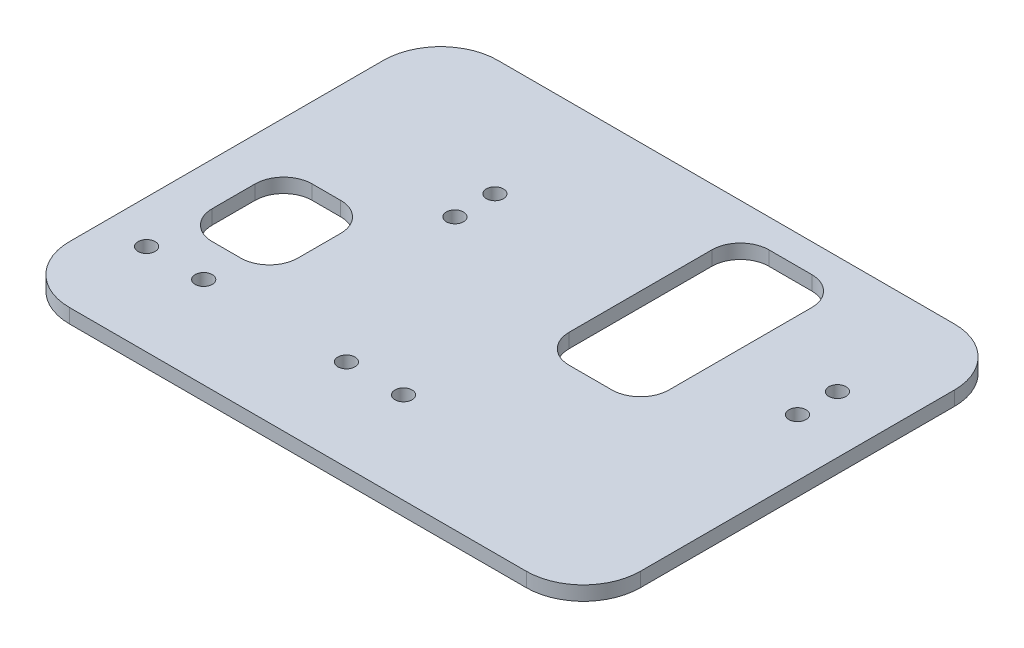
ISO-10303-21;
HEADER;
FILE_DESCRIPTION(('STEP AP214'),'2;1');
FILE_NAME('part.step','',(''),(''),'','','');
FILE_SCHEMA(('AUTOMOTIVE_DESIGN { 1 0 10303 214 1 1 1 1 }'));
ENDSEC;
DATA;
#1=APPLICATION_CONTEXT('core data for automotive mechanical design processes');
#2=APPLICATION_PROTOCOL_DEFINITION('international standard','automotive_design',2000,#1);
#3=PRODUCT_CONTEXT('',#1,'mechanical');
#4=PRODUCT('Part','Part','',(#3));
#5=PRODUCT_RELATED_PRODUCT_CATEGORY('part','',(#4));
#6=PRODUCT_DEFINITION_FORMATION('','',#4);
#7=PRODUCT_DEFINITION_CONTEXT('part definition',#1,'design');
#8=PRODUCT_DEFINITION('design','',#6,#7);
#9=PRODUCT_DEFINITION_SHAPE('','',#8);
#10=(LENGTH_UNIT() NAMED_UNIT(*) SI_UNIT(.MILLI.,.METRE.));
#11=(NAMED_UNIT(*) PLANE_ANGLE_UNIT() SI_UNIT($,.RADIAN.));
#12=(NAMED_UNIT(*) SI_UNIT($,.STERADIAN.) SOLID_ANGLE_UNIT());
#13=UNCERTAINTY_MEASURE_WITH_UNIT(LENGTH_MEASURE(1.E-05),#10,'distance_accuracy_value','');
#14=(GEOMETRIC_REPRESENTATION_CONTEXT(3) GLOBAL_UNCERTAINTY_ASSIGNED_CONTEXT((#13)) GLOBAL_UNIT_ASSIGNED_CONTEXT((#10,
#11,#12)) REPRESENTATION_CONTEXT('',''));
#15=CARTESIAN_POINT('',(0.,0.,0.));
#16=DIRECTION('',(0.,0.,1.));
#17=DIRECTION('',(1.,0.,0.));
#18=AXIS2_PLACEMENT_3D('',#15,#16,#17);
#19=CARTESIAN_POINT('',(-85.,5.,-75.));
#20=DIRECTION('',(1.,0.,0.));
#21=DIRECTION('',(0.,0.,-1.));
#22=AXIS2_PLACEMENT_3D('',#19,#20,#21);
#23=PLANE('',#22);
#24=DIRECTION('',(0.,0.,1.));
#25=VECTOR('',#24,1.);
#26=CARTESIAN_POINT('',(-85.,5.,-75.));
#27=LINE('',#26,#25);
#28=CARTESIAN_POINT('',(-85.,5.,-55.));
#29=VERTEX_POINT('',#28);
#30=CARTESIAN_POINT('',(-85.,5.,55.));
#31=VERTEX_POINT('',#30);
#32=EDGE_CURVE('E315',#29,#31,#27,.T.);
#33=ORIENTED_EDGE('',*,*,#32,.F.);
#34=DIRECTION('',(0.,-1.,0.));
#35=VECTOR('',#34,1.);
#36=CARTESIAN_POINT('',(-85.,0.,-55.));
#37=LINE('',#36,#35);
#38=CARTESIAN_POINT('',(-85.,0.,-55.));
#39=VERTEX_POINT('',#38);
#40=EDGE_CURVE('E11',#29,#39,#37,.T.);
#41=ORIENTED_EDGE('',*,*,#40,.T.);
#42=DIRECTION('',(0.,0.,1.));
#43=VECTOR('',#42,1.);
#44=CARTESIAN_POINT('',(-85.,0.,-75.));
#45=LINE('',#44,#43);
#46=CARTESIAN_POINT('',(-85.,0.,55.));
#47=VERTEX_POINT('',#46);
#48=EDGE_CURVE('E328',#39,#47,#45,.T.);
#49=ORIENTED_EDGE('',*,*,#48,.T.);
#50=DIRECTION('',(0.,-1.,0.));
#51=VECTOR('',#50,1.);
#52=CARTESIAN_POINT('',(-85.,5.,55.));
#53=LINE('',#52,#51);
#54=EDGE_CURVE('E43',#47,#31,#53,.F.);
#55=ORIENTED_EDGE('',*,*,#54,.T.);
#56=EDGE_LOOP('',(#33,#41,#49,#55));
#57=FACE_BOUND('',#56,.T.);
#58=ADVANCED_FACE('F35',(#57),#23,.F.);
#59=CARTESIAN_POINT('',(-85.,5.,75.));
#60=DIRECTION('',(0.,0.,-1.));
#61=DIRECTION('',(-1.,0.,0.));
#62=AXIS2_PLACEMENT_3D('',#59,#60,#61);
#63=PLANE('',#62);
#64=DIRECTION('',(1.,0.,0.));
#65=VECTOR('',#64,1.);
#66=CARTESIAN_POINT('',(-85.,0.,75.));
#67=LINE('',#66,#65);
#68=CARTESIAN_POINT('',(-65.,0.,75.));
#69=VERTEX_POINT('',#68);
#70=CARTESIAN_POINT('',(95.,0.,75.));
#71=VERTEX_POINT('',#70);
#72=EDGE_CURVE('E331',#69,#71,#67,.T.);
#73=ORIENTED_EDGE('',*,*,#72,.T.);
#74=DIRECTION('',(0.,-1.,0.));
#75=VECTOR('',#74,1.);
#76=CARTESIAN_POINT('',(95.,5.,75.));
#77=LINE('',#76,#75);
#78=CARTESIAN_POINT('',(95.,5.,75.));
#79=VERTEX_POINT('',#78);
#80=EDGE_CURVE('E420',#71,#79,#77,.F.);
#81=ORIENTED_EDGE('',*,*,#80,.T.);
#82=DIRECTION('',(1.,0.,0.));
#83=VECTOR('',#82,1.);
#84=CARTESIAN_POINT('',(-85.,5.,75.));
#85=LINE('',#84,#83);
#86=CARTESIAN_POINT('',(-65.,5.,75.));
#87=VERTEX_POINT('',#86);
#88=EDGE_CURVE('E318',#87,#79,#85,.T.);
#89=ORIENTED_EDGE('',*,*,#88,.F.);
#90=DIRECTION('',(0.,-1.,0.));
#91=VECTOR('',#90,1.);
#92=CARTESIAN_POINT('',(-65.,5.,75.));
#93=LINE('',#92,#91);
#94=EDGE_CURVE('E417',#87,#69,#93,.T.);
#95=ORIENTED_EDGE('',*,*,#94,.T.);
#96=EDGE_LOOP('',(#73,#81,#89,#95));
#97=FACE_BOUND('',#96,.T.);
#98=ADVANCED_FACE('F444',(#97),#63,.F.);
#99=CARTESIAN_POINT('',(115.,5.,-75.));
#100=DIRECTION('',(1.,0.,0.));
#101=DIRECTION('',(0.,0.,-1.));
#102=AXIS2_PLACEMENT_3D('',#99,#100,#101);
#103=PLANE('',#102);
#104=DIRECTION('',(0.,0.,1.));
#105=VECTOR('',#104,1.);
#106=CARTESIAN_POINT('',(115.,5.,-75.));
#107=LINE('',#106,#105);
#108=CARTESIAN_POINT('',(115.,5.,-55.));
#109=VERTEX_POINT('',#108);
#110=CARTESIAN_POINT('',(115.,5.,55.));
#111=VERTEX_POINT('',#110);
#112=EDGE_CURVE('E322',#109,#111,#107,.T.);
#113=ORIENTED_EDGE('',*,*,#112,.T.);
#114=DIRECTION('',(0.,-1.,0.));
#115=VECTOR('',#114,1.);
#116=CARTESIAN_POINT('',(115.,0.,55.));
#117=LINE('',#116,#115);
#118=CARTESIAN_POINT('',(115.,0.,55.));
#119=VERTEX_POINT('',#118);
#120=EDGE_CURVE('E406',#111,#119,#117,.T.);
#121=ORIENTED_EDGE('',*,*,#120,.T.);
#122=DIRECTION('',(0.,0.,1.));
#123=VECTOR('',#122,1.);
#124=CARTESIAN_POINT('',(115.,0.,-75.));
#125=LINE('',#124,#123);
#126=CARTESIAN_POINT('',(115.,0.,-55.));
#127=VERTEX_POINT('',#126);
#128=EDGE_CURVE('E334',#127,#119,#125,.T.);
#129=ORIENTED_EDGE('',*,*,#128,.F.);
#130=DIRECTION('',(0.,-1.,0.));
#131=VECTOR('',#130,1.);
#132=CARTESIAN_POINT('',(115.,5.,-55.));
#133=LINE('',#132,#131);
#134=EDGE_CURVE('E400',#127,#109,#133,.F.);
#135=ORIENTED_EDGE('',*,*,#134,.T.);
#136=EDGE_LOOP('',(#113,#121,#129,#135));
#137=FACE_BOUND('',#136,.T.);
#138=ADVANCED_FACE('F454',(#137),#103,.T.);
#139=CARTESIAN_POINT('',(-85.,5.,-75.));
#140=DIRECTION('',(0.,0.,-1.));
#141=DIRECTION('',(-1.,0.,0.));
#142=AXIS2_PLACEMENT_3D('',#139,#140,#141);
#143=PLANE('',#142);
#144=DIRECTION('',(1.,0.,0.));
#145=VECTOR('',#144,1.);
#146=CARTESIAN_POINT('',(-85.,5.,-75.));
#147=LINE('',#146,#145);
#148=CARTESIAN_POINT('',(-65.,5.,-75.));
#149=VERTEX_POINT('',#148);
#150=CARTESIAN_POINT('',(95.,5.,-75.));
#151=VERTEX_POINT('',#150);
#152=EDGE_CURVE('E325',#149,#151,#147,.T.);
#153=ORIENTED_EDGE('',*,*,#152,.T.);
#154=DIRECTION('',(0.,-1.,0.));
#155=VECTOR('',#154,1.);
#156=CARTESIAN_POINT('',(95.,5.,-75.));
#157=LINE('',#156,#155);
#158=CARTESIAN_POINT('',(95.,0.,-75.));
#159=VERTEX_POINT('',#158);
#160=EDGE_CURVE('E430',#151,#159,#157,.T.);
#161=ORIENTED_EDGE('',*,*,#160,.T.);
#162=DIRECTION('',(1.,0.,0.));
#163=VECTOR('',#162,1.);
#164=CARTESIAN_POINT('',(-85.,0.,-75.));
#165=LINE('',#164,#163);
#166=CARTESIAN_POINT('',(-65.,0.,-75.));
#167=VERTEX_POINT('',#166);
#168=EDGE_CURVE('E319',#167,#159,#165,.T.);
#169=ORIENTED_EDGE('',*,*,#168,.F.);
#170=DIRECTION('',(0.,-1.,0.));
#171=VECTOR('',#170,1.);
#172=CARTESIAN_POINT('',(-65.,5.,-75.));
#173=LINE('',#172,#171);
#174=EDGE_CURVE('E57',#167,#149,#173,.F.);
#175=ORIENTED_EDGE('',*,*,#174,.T.);
#176=EDGE_LOOP('',(#153,#161,#169,#175));
#177=FACE_BOUND('',#176,.T.);
#178=ADVANCED_FACE('F459',(#177),#143,.T.);
#179=CARTESIAN_POINT('',(0.,5.,0.));
#180=DIRECTION('',(0.,1.,0.));
#181=DIRECTION('',(0.,0.,1.));
#182=AXIS2_PLACEMENT_3D('',#179,#180,#181);
#183=PLANE('',#182);
#184=CARTESIAN_POINT('',(95.,5.,-20.));
#185=DIRECTION('',(0.,1.,0.));
#186=DIRECTION('',(0.,0.,1.));
#187=AXIS2_PLACEMENT_3D('',#184,#185,#186);
#188=CIRCLE('',#187,3.00000000000001);
#189=CARTESIAN_POINT('',(95.,5.,-17.));
#190=VERTEX_POINT('',#189);
#191=EDGE_CURVE('E255',#190,#190,#188,.T.);
#192=ORIENTED_EDGE('',*,*,#191,.F.);
#193=EDGE_LOOP('',(#192));
#194=FACE_BOUND('',#193,.T.);
#195=CARTESIAN_POINT('',(95.,5.,-34.));
#196=DIRECTION('',(0.,1.,0.));
#197=DIRECTION('',(0.,0.,1.));
#198=AXIS2_PLACEMENT_3D('',#195,#196,#197);
#199=CIRCLE('',#198,3.00000000000001);
#200=CARTESIAN_POINT('',(95.,5.,-31.));
#201=VERTEX_POINT('',#200);
#202=EDGE_CURVE('E244',#201,#201,#199,.T.);
#203=ORIENTED_EDGE('',*,*,#202,.F.);
#204=EDGE_LOOP('',(#203));
#205=FACE_BOUND('',#204,.T.);
#206=CARTESIAN_POINT('',(40.,5.,-55.));
#207=DIRECTION('',(0.,1.,0.));
#208=DIRECTION('',(0.,0.,-1.));
#209=AXIS2_PLACEMENT_3D('',#206,#207,#208);
#210=CIRCLE('',#209,10.);
#211=CARTESIAN_POINT('',(40.,5.,-65.));
#212=VERTEX_POINT('',#211);
#213=CARTESIAN_POINT('',(30.,5.,-55.));
#214=VERTEX_POINT('',#213);
#215=EDGE_CURVE('E219',#212,#214,#210,.T.);
#216=ORIENTED_EDGE('',*,*,#215,.F.);
#217=DIRECTION('',(-1.,0.,0.));
#218=VECTOR('',#217,1.);
#219=CARTESIAN_POINT('',(40.,5.,-65.));
#220=LINE('',#219,#218);
#221=CARTESIAN_POINT('',(55.,5.,-65.));
#222=VERTEX_POINT('',#221);
#223=EDGE_CURVE('E239',#222,#212,#220,.T.);
#224=ORIENTED_EDGE('',*,*,#223,.F.);
#225=CARTESIAN_POINT('',(55.,5.,-55.));
#226=DIRECTION('',(0.,1.,0.));
#227=DIRECTION('',(0.,0.,-1.));
#228=AXIS2_PLACEMENT_3D('',#225,#226,#227);
#229=CIRCLE('',#228,10.);
#230=CARTESIAN_POINT('',(65.,5.,-55.));
#231=VERTEX_POINT('',#230);
#232=EDGE_CURVE('E236',#231,#222,#229,.T.);
#233=ORIENTED_EDGE('',*,*,#232,.F.);
#234=DIRECTION('',(0.,0.,-1.));
#235=VECTOR('',#234,1.);
#236=CARTESIAN_POINT('',(65.,5.,-5.00000000000001));
#237=LINE('',#236,#235);
#238=CARTESIAN_POINT('',(65.,5.,-5.00000000000001));
#239=VERTEX_POINT('',#238);
#240=EDGE_CURVE('E233',#239,#231,#237,.T.);
#241=ORIENTED_EDGE('',*,*,#240,.F.);
#242=CARTESIAN_POINT('',(55.,5.,-5.00000000000001));
#243=DIRECTION('',(0.,1.,0.));
#244=DIRECTION('',(0.,0.,1.));
#245=AXIS2_PLACEMENT_3D('',#242,#243,#244);
#246=CIRCLE('',#245,10.);
#247=CARTESIAN_POINT('',(55.,5.,4.99999999999999));
#248=VERTEX_POINT('',#247);
#249=EDGE_CURVE('E227',#248,#239,#246,.T.);
#250=ORIENTED_EDGE('',*,*,#249,.F.);
#251=DIRECTION('',(1.,0.,0.));
#252=VECTOR('',#251,1.);
#253=CARTESIAN_POINT('',(40.,5.,4.99999999999999));
#254=LINE('',#253,#252);
#255=CARTESIAN_POINT('',(40.,5.,4.99999999999999));
#256=VERTEX_POINT('',#255);
#257=EDGE_CURVE('E225',#256,#248,#254,.T.);
#258=ORIENTED_EDGE('',*,*,#257,.F.);
#259=CARTESIAN_POINT('',(40.,5.,-5.00000000000001));
#260=DIRECTION('',(0.,1.,0.));
#261=DIRECTION('',(0.,0.,-1.));
#262=AXIS2_PLACEMENT_3D('',#259,#260,#261);
#263=CIRCLE('',#262,10.);
#264=CARTESIAN_POINT('',(30.,5.,-5.00000000000001));
#265=VERTEX_POINT('',#264);
#266=EDGE_CURVE('E203',#265,#256,#263,.T.);
#267=ORIENTED_EDGE('',*,*,#266,.F.);
#268=DIRECTION('',(0.,0.,1.));
#269=VECTOR('',#268,1.);
#270=CARTESIAN_POINT('',(30.,5.,-5.00000000000001));
#271=LINE('',#270,#269);
#272=EDGE_CURVE('E214',#214,#265,#271,.T.);
#273=ORIENTED_EDGE('',*,*,#272,.F.);
#274=EDGE_LOOP('',(#216,#224,#233,#241,#250,#258,#267,#273));
#275=FACE_BOUND('',#274,.T.);
#276=CARTESIAN_POINT('',(-25.,5.,-34.));
#277=DIRECTION('',(0.,1.,0.));
#278=DIRECTION('',(0.,0.,1.));
#279=AXIS2_PLACEMENT_3D('',#276,#277,#278);
#280=CIRCLE('',#279,2.99999999999999);
#281=CARTESIAN_POINT('',(-25.,5.,-31.));
#282=VERTEX_POINT('',#281);
#283=EDGE_CURVE('E258',#282,#282,#280,.T.);
#284=ORIENTED_EDGE('',*,*,#283,.F.);
#285=EDGE_LOOP('',(#284));
#286=FACE_BOUND('',#285,.T.);
#287=CARTESIAN_POINT('',(-25.,5.,-20.));
#288=DIRECTION('',(0.,1.,0.));
#289=DIRECTION('',(0.,0.,1.));
#290=AXIS2_PLACEMENT_3D('',#287,#288,#289);
#291=CIRCLE('',#290,2.99999999999999);
#292=CARTESIAN_POINT('',(-25.,5.,-17.));
#293=VERTEX_POINT('',#292);
#294=EDGE_CURVE('E267',#293,#293,#291,.T.);
#295=ORIENTED_EDGE('',*,*,#294,.F.);
#296=EDGE_LOOP('',(#295));
#297=FACE_BOUND('',#296,.T.);
#298=CARTESIAN_POINT('',(-50.,5.,43.));
#299=DIRECTION('',(0.,1.,0.));
#300=DIRECTION('',(0.,0.,1.));
#301=AXIS2_PLACEMENT_3D('',#298,#299,#300);
#302=CIRCLE('',#301,3.);
#303=CARTESIAN_POINT('',(-50.,5.,46.));
#304=VERTEX_POINT('',#303);
#305=EDGE_CURVE('E304',#304,#304,#302,.T.);
#306=ORIENTED_EDGE('',*,*,#305,.F.);
#307=EDGE_LOOP('',(#306));
#308=FACE_BOUND('',#307,.T.);
#309=CARTESIAN_POINT('',(0.,5.,43.));
#310=DIRECTION('',(0.,1.,0.));
#311=DIRECTION('',(0.,0.,1.));
#312=AXIS2_PLACEMENT_3D('',#309,#310,#311);
#313=CIRCLE('',#312,3.);
#314=CARTESIAN_POINT('',(0.,5.,46.));
#315=VERTEX_POINT('',#314);
#316=EDGE_CURVE('E262',#315,#315,#313,.T.);
#317=ORIENTED_EDGE('',*,*,#316,.F.);
#318=EDGE_LOOP('',(#317));
#319=FACE_BOUND('',#318,.T.);
#320=CARTESIAN_POINT('',(20.,5.,43.));
#321=DIRECTION('',(0.,1.,0.));
#322=DIRECTION('',(0.,0.,1.));
#323=AXIS2_PLACEMENT_3D('',#320,#321,#322);
#324=CIRCLE('',#323,3.00000000000001);
#325=CARTESIAN_POINT('',(20.,5.,46.));
#326=VERTEX_POINT('',#325);
#327=EDGE_CURVE('E259',#326,#326,#324,.T.);
#328=ORIENTED_EDGE('',*,*,#327,.F.);
#329=EDGE_LOOP('',(#328));
#330=FACE_BOUND('',#329,.T.);
#331=CARTESIAN_POINT('',(-60.,5.,4.99999999999999));
#332=DIRECTION('',(0.,1.,0.));
#333=DIRECTION('',(0.,0.,-1.));
#334=AXIS2_PLACEMENT_3D('',#331,#332,#333);
#335=CIRCLE('',#334,10.);
#336=CARTESIAN_POINT('',(-60.,5.,-5.00000000000001));
#337=VERTEX_POINT('',#336);
#338=CARTESIAN_POINT('',(-70.,5.,5.00000000000007));
#339=VERTEX_POINT('',#338);
#340=EDGE_CURVE('E264',#337,#339,#335,.T.);
#341=ORIENTED_EDGE('',*,*,#340,.F.);
#342=DIRECTION('',(-1.,0.,0.));
#343=VECTOR('',#342,1.);
#344=CARTESIAN_POINT('',(-60.,5.,-5.00000000000001));
#345=LINE('',#344,#343);
#346=CARTESIAN_POINT('',(-50.0000000000001,5.,-5.00000000000001));
#347=VERTEX_POINT('',#346);
#348=EDGE_CURVE('E285',#347,#337,#345,.T.);
#349=ORIENTED_EDGE('',*,*,#348,.F.);
#350=CARTESIAN_POINT('',(-50.,5.,4.99999999999999));
#351=DIRECTION('',(0.,1.,0.));
#352=DIRECTION('',(0.,0.,-1.));
#353=AXIS2_PLACEMENT_3D('',#350,#351,#352);
#354=CIRCLE('',#353,10.);
#355=CARTESIAN_POINT('',(-40.,5.,5.00000000000006));
#356=VERTEX_POINT('',#355);
#357=EDGE_CURVE('E282',#356,#347,#354,.T.);
#358=ORIENTED_EDGE('',*,*,#357,.F.);
#359=DIRECTION('',(0.,0.,-1.));
#360=VECTOR('',#359,1.);
#361=CARTESIAN_POINT('',(-40.,5.,19.9999999999999));
#362=LINE('',#361,#360);
#363=CARTESIAN_POINT('',(-40.,5.,19.9999999999999));
#364=VERTEX_POINT('',#363);
#365=EDGE_CURVE('E279',#364,#356,#362,.T.);
#366=ORIENTED_EDGE('',*,*,#365,.F.);
#367=CARTESIAN_POINT('',(-50.,5.,20.));
#368=DIRECTION('',(0.,1.,0.));
#369=DIRECTION('',(0.,0.,1.));
#370=AXIS2_PLACEMENT_3D('',#367,#368,#369);
#371=CIRCLE('',#370,10.);
#372=CARTESIAN_POINT('',(-50.0000000000001,5.,30.));
#373=VERTEX_POINT('',#372);
#374=EDGE_CURVE('E276',#373,#364,#371,.T.);
#375=ORIENTED_EDGE('',*,*,#374,.F.);
#376=DIRECTION('',(1.,0.,0.));
#377=VECTOR('',#376,1.);
#378=CARTESIAN_POINT('',(-59.9999999999999,5.,30.));
#379=LINE('',#378,#377);
#380=CARTESIAN_POINT('',(-59.9999999999999,5.,30.));
#381=VERTEX_POINT('',#380);
#382=EDGE_CURVE('E273',#381,#373,#379,.T.);
#383=ORIENTED_EDGE('',*,*,#382,.F.);
#384=CARTESIAN_POINT('',(-60.,5.,20.));
#385=DIRECTION('',(0.,1.,0.));
#386=DIRECTION('',(0.,0.,-1.));
#387=AXIS2_PLACEMENT_3D('',#384,#385,#386);
#388=CIRCLE('',#387,10.);
#389=CARTESIAN_POINT('',(-70.,5.,19.9999999999999));
#390=VERTEX_POINT('',#389);
#391=EDGE_CURVE('E270',#390,#381,#388,.T.);
#392=ORIENTED_EDGE('',*,*,#391,.F.);
#393=DIRECTION('',(0.,0.,1.));
#394=VECTOR('',#393,1.);
#395=CARTESIAN_POINT('',(-70.,5.,19.9999999999999));
#396=LINE('',#395,#394);
#397=EDGE_CURVE('E266',#339,#390,#396,.T.);
#398=ORIENTED_EDGE('',*,*,#397,.F.);
#399=EDGE_LOOP('',(#341,#349,#358,#366,#375,#383,#392,#398));
#400=FACE_BOUND('',#399,.T.);
#401=CARTESIAN_POINT('',(-70.,5.,43.));
#402=DIRECTION('',(0.,1.,0.));
#403=DIRECTION('',(0.,0.,1.));
#404=AXIS2_PLACEMENT_3D('',#401,#402,#403);
#405=CIRCLE('',#404,3.00000000000001);
#406=CARTESIAN_POINT('',(-70.,5.,46.));
#407=VERTEX_POINT('',#406);
#408=EDGE_CURVE('E310',#407,#407,#405,.T.);
#409=ORIENTED_EDGE('',*,*,#408,.F.);
#410=EDGE_LOOP('',(#409));
#411=FACE_BOUND('',#410,.T.);
#412=ORIENTED_EDGE('',*,*,#88,.T.);
#413=CARTESIAN_POINT('',(95.,5.,55.));
#414=DIRECTION('',(0.,1.,0.));
#415=DIRECTION('',(0.,0.,1.));
#416=AXIS2_PLACEMENT_3D('',#413,#414,#415);
#417=CIRCLE('',#416,20.);
#418=EDGE_CURVE('E427',#79,#111,#417,.T.);
#419=ORIENTED_EDGE('',*,*,#418,.T.);
#420=ORIENTED_EDGE('',*,*,#112,.F.);
#421=CARTESIAN_POINT('',(95.,5.,-55.));
#422=DIRECTION('',(0.,1.,0.));
#423=DIRECTION('',(0.,0.,1.));
#424=AXIS2_PLACEMENT_3D('',#421,#422,#423);
#425=CIRCLE('',#424,20.);
#426=EDGE_CURVE('E50',#109,#151,#425,.T.);
#427=ORIENTED_EDGE('',*,*,#426,.T.);
#428=ORIENTED_EDGE('',*,*,#152,.F.);
#429=CARTESIAN_POINT('',(-65.,5.,-55.));
#430=DIRECTION('',(0.,1.,0.));
#431=DIRECTION('',(0.,0.,1.));
#432=AXIS2_PLACEMENT_3D('',#429,#430,#431);
#433=CIRCLE('',#432,20.);
#434=EDGE_CURVE('E424',#149,#29,#433,.T.);
#435=ORIENTED_EDGE('',*,*,#434,.T.);
#436=ORIENTED_EDGE('',*,*,#32,.T.);
#437=CARTESIAN_POINT('',(-65.,5.,55.));
#438=DIRECTION('',(0.,1.,0.));
#439=DIRECTION('',(0.,0.,1.));
#440=AXIS2_PLACEMENT_3D('',#437,#438,#439);
#441=CIRCLE('',#440,20.);
#442=EDGE_CURVE('E422',#31,#87,#441,.T.);
#443=ORIENTED_EDGE('',*,*,#442,.T.);
#444=EDGE_LOOP('',(#412,#419,#420,#427,#428,#435,#436,#443));
#445=FACE_BOUND('',#444,.T.);
#446=ADVANCED_FACE('F221',(#194,#205,#275,#286,#297,#308,#319,#330,#400,#411,#445),#183,.T.);
#447=CARTESIAN_POINT('',(0.,0.,0.));
#448=DIRECTION('',(0.,1.,0.));
#449=DIRECTION('',(0.,0.,1.));
#450=AXIS2_PLACEMENT_3D('',#447,#448,#449);
#451=PLANE('',#450);
#452=CARTESIAN_POINT('',(95.,0.,-20.));
#453=DIRECTION('',(0.,1.,0.));
#454=DIRECTION('',(0.,0.,1.));
#455=AXIS2_PLACEMENT_3D('',#452,#453,#454);
#456=CIRCLE('',#455,3.00000000000001);
#457=CARTESIAN_POINT('',(95.,0.,-17.));
#458=VERTEX_POINT('',#457);
#459=EDGE_CURVE('E314',#458,#458,#456,.T.);
#460=ORIENTED_EDGE('',*,*,#459,.T.);
#461=EDGE_LOOP('',(#460));
#462=FACE_BOUND('',#461,.T.);
#463=CARTESIAN_POINT('',(95.,0.,-34.));
#464=DIRECTION('',(0.,1.,0.));
#465=DIRECTION('',(0.,0.,1.));
#466=AXIS2_PLACEMENT_3D('',#463,#464,#465);
#467=CIRCLE('',#466,3.00000000000001);
#468=CARTESIAN_POINT('',(95.,0.,-31.));
#469=VERTEX_POINT('',#468);
#470=EDGE_CURVE('E379',#469,#469,#467,.T.);
#471=ORIENTED_EDGE('',*,*,#470,.T.);
#472=EDGE_LOOP('',(#471));
#473=FACE_BOUND('',#472,.T.);
#474=DIRECTION('',(-1.,0.,0.));
#475=VECTOR('',#474,1.);
#476=CARTESIAN_POINT('',(0.,0.,-65.));
#477=LINE('',#476,#475);
#478=CARTESIAN_POINT('',(55.,0.,-65.));
#479=VERTEX_POINT('',#478);
#480=CARTESIAN_POINT('',(40.,0.,-65.));
#481=VERTEX_POINT('',#480);
#482=EDGE_CURVE('E394',#479,#481,#477,.T.);
#483=ORIENTED_EDGE('',*,*,#482,.T.);
#484=CARTESIAN_POINT('',(40.,0.,-55.));
#485=DIRECTION('',(0.,1.,0.));
#486=DIRECTION('',(0.,0.,1.));
#487=AXIS2_PLACEMENT_3D('',#484,#485,#486);
#488=CIRCLE('',#487,10.);
#489=CARTESIAN_POINT('',(30.,0.,-55.));
#490=VERTEX_POINT('',#489);
#491=EDGE_CURVE('E397',#481,#490,#488,.T.);
#492=ORIENTED_EDGE('',*,*,#491,.T.);
#493=DIRECTION('',(0.,0.,1.));
#494=VECTOR('',#493,1.);
#495=CARTESIAN_POINT('',(30.,0.,0.));
#496=LINE('',#495,#494);
#497=CARTESIAN_POINT('',(30.,0.,-5.00000000000001));
#498=VERTEX_POINT('',#497);
#499=EDGE_CURVE('E364',#490,#498,#496,.T.);
#500=ORIENTED_EDGE('',*,*,#499,.T.);
#501=CARTESIAN_POINT('',(40.,0.,-5.00000000000001));
#502=DIRECTION('',(0.,1.,0.));
#503=DIRECTION('',(0.,0.,1.));
#504=AXIS2_PLACEMENT_3D('',#501,#502,#503);
#505=CIRCLE('',#504,10.);
#506=CARTESIAN_POINT('',(40.,0.,4.99999999999999));
#507=VERTEX_POINT('',#506);
#508=EDGE_CURVE('E206',#498,#507,#505,.T.);
#509=ORIENTED_EDGE('',*,*,#508,.T.);
#510=DIRECTION('',(1.,0.,0.));
#511=VECTOR('',#510,1.);
#512=CARTESIAN_POINT('',(0.,0.,4.99999999999999));
#513=LINE('',#512,#511);
#514=CARTESIAN_POINT('',(55.,0.,4.99999999999999));
#515=VERTEX_POINT('',#514);
#516=EDGE_CURVE('E382',#507,#515,#513,.T.);
#517=ORIENTED_EDGE('',*,*,#516,.T.);
#518=CARTESIAN_POINT('',(55.,0.,-5.00000000000001));
#519=DIRECTION('',(0.,1.,0.));
#520=DIRECTION('',(0.,0.,1.));
#521=AXIS2_PLACEMENT_3D('',#518,#519,#520);
#522=CIRCLE('',#521,10.);
#523=CARTESIAN_POINT('',(65.,0.,-5.00000000000001));
#524=VERTEX_POINT('',#523);
#525=EDGE_CURVE('E385',#515,#524,#522,.T.);
#526=ORIENTED_EDGE('',*,*,#525,.T.);
#527=DIRECTION('',(0.,0.,-1.));
#528=VECTOR('',#527,1.);
#529=CARTESIAN_POINT('',(65.,0.,0.));
#530=LINE('',#529,#528);
#531=CARTESIAN_POINT('',(65.,0.,-55.));
#532=VERTEX_POINT('',#531);
#533=EDGE_CURVE('E388',#524,#532,#530,.T.);
#534=ORIENTED_EDGE('',*,*,#533,.T.);
#535=CARTESIAN_POINT('',(55.,0.,-55.));
#536=DIRECTION('',(0.,1.,0.));
#537=DIRECTION('',(0.,0.,1.));
#538=AXIS2_PLACEMENT_3D('',#535,#536,#537);
#539=CIRCLE('',#538,10.);
#540=EDGE_CURVE('E391',#532,#479,#539,.T.);
#541=ORIENTED_EDGE('',*,*,#540,.T.);
#542=EDGE_LOOP('',(#483,#492,#500,#509,#517,#526,#534,#541));
#543=FACE_BOUND('',#542,.T.);
#544=CARTESIAN_POINT('',(-25.,0.,-34.));
#545=DIRECTION('',(0.,1.,0.));
#546=DIRECTION('',(0.,0.,1.));
#547=AXIS2_PLACEMENT_3D('',#544,#545,#546);
#548=CIRCLE('',#547,2.99999999999999);
#549=CARTESIAN_POINT('',(-25.,0.,-31.));
#550=VERTEX_POINT('',#549);
#551=EDGE_CURVE('E376',#550,#550,#548,.T.);
#552=ORIENTED_EDGE('',*,*,#551,.T.);
#553=EDGE_LOOP('',(#552));
#554=FACE_BOUND('',#553,.T.);
#555=CARTESIAN_POINT('',(-25.,0.,-20.));
#556=DIRECTION('',(0.,1.,0.));
#557=DIRECTION('',(0.,0.,1.));
#558=AXIS2_PLACEMENT_3D('',#555,#556,#557);
#559=CIRCLE('',#558,2.99999999999999);
#560=CARTESIAN_POINT('',(-25.,0.,-17.));
#561=VERTEX_POINT('',#560);
#562=EDGE_CURVE('E373',#561,#561,#559,.T.);
#563=ORIENTED_EDGE('',*,*,#562,.T.);
#564=EDGE_LOOP('',(#563));
#565=FACE_BOUND('',#564,.T.);
#566=CARTESIAN_POINT('',(-50.,0.,43.));
#567=DIRECTION('',(0.,1.,0.));
#568=DIRECTION('',(0.,0.,1.));
#569=AXIS2_PLACEMENT_3D('',#566,#567,#568);
#570=CIRCLE('',#569,3.);
#571=CARTESIAN_POINT('',(-50.,0.,46.));
#572=VERTEX_POINT('',#571);
#573=EDGE_CURVE('E370',#572,#572,#570,.T.);
#574=ORIENTED_EDGE('',*,*,#573,.T.);
#575=EDGE_LOOP('',(#574));
#576=FACE_BOUND('',#575,.T.);
#577=CARTESIAN_POINT('',(0.,0.,43.));
#578=DIRECTION('',(0.,1.,0.));
#579=DIRECTION('',(0.,0.,1.));
#580=AXIS2_PLACEMENT_3D('',#577,#578,#579);
#581=CIRCLE('',#580,3.);
#582=CARTESIAN_POINT('',(0.,0.,46.));
#583=VERTEX_POINT('',#582);
#584=EDGE_CURVE('E367',#583,#583,#581,.T.);
#585=ORIENTED_EDGE('',*,*,#584,.T.);
#586=EDGE_LOOP('',(#585));
#587=FACE_BOUND('',#586,.T.);
#588=CARTESIAN_POINT('',(20.,0.,43.));
#589=DIRECTION('',(0.,1.,0.));
#590=DIRECTION('',(0.,0.,1.));
#591=AXIS2_PLACEMENT_3D('',#588,#589,#590);
#592=CIRCLE('',#591,3.00000000000001);
#593=CARTESIAN_POINT('',(20.,0.,46.));
#594=VERTEX_POINT('',#593);
#595=EDGE_CURVE('E307',#594,#594,#592,.T.);
#596=ORIENTED_EDGE('',*,*,#595,.T.);
#597=EDGE_LOOP('',(#596));
#598=FACE_BOUND('',#597,.T.);
#599=DIRECTION('',(-1.,0.,0.));
#600=VECTOR('',#599,1.);
#601=CARTESIAN_POINT('',(0.,0.,-5.00000000000002));
#602=LINE('',#601,#600);
#603=CARTESIAN_POINT('',(-50.0000000000001,0.,-5.00000000000001));
#604=VERTEX_POINT('',#603);
#605=CARTESIAN_POINT('',(-60.,0.,-5.00000000000001));
#606=VERTEX_POINT('',#605);
#607=EDGE_CURVE('E358',#604,#606,#602,.T.);
#608=ORIENTED_EDGE('',*,*,#607,.T.);
#609=CARTESIAN_POINT('',(-60.,0.,4.99999999999999));
#610=DIRECTION('',(0.,1.,0.));
#611=DIRECTION('',(0.,0.,1.));
#612=AXIS2_PLACEMENT_3D('',#609,#610,#611);
#613=CIRCLE('',#612,10.);
#614=CARTESIAN_POINT('',(-70.,0.,5.00000000000007));
#615=VERTEX_POINT('',#614);
#616=EDGE_CURVE('E361',#606,#615,#613,.T.);
#617=ORIENTED_EDGE('',*,*,#616,.T.);
#618=DIRECTION('',(0.,0.,1.));
#619=VECTOR('',#618,1.);
#620=CARTESIAN_POINT('',(-70.,0.,0.));
#621=LINE('',#620,#619);
#622=CARTESIAN_POINT('',(-70.,0.,19.9999999999999));
#623=VERTEX_POINT('',#622);
#624=EDGE_CURVE('E327',#615,#623,#621,.T.);
#625=ORIENTED_EDGE('',*,*,#624,.T.);
#626=CARTESIAN_POINT('',(-60.,0.,20.));
#627=DIRECTION('',(0.,1.,0.));
#628=DIRECTION('',(0.,0.,1.));
#629=AXIS2_PLACEMENT_3D('',#626,#627,#628);
#630=CIRCLE('',#629,10.);
#631=CARTESIAN_POINT('',(-59.9999999999999,0.,30.));
#632=VERTEX_POINT('',#631);
#633=EDGE_CURVE('E343',#623,#632,#630,.T.);
#634=ORIENTED_EDGE('',*,*,#633,.T.);
#635=DIRECTION('',(1.,0.,0.));
#636=VECTOR('',#635,1.);
#637=CARTESIAN_POINT('',(0.,0.,30.));
#638=LINE('',#637,#636);
#639=CARTESIAN_POINT('',(-50.0000000000001,0.,30.));
#640=VERTEX_POINT('',#639);
#641=EDGE_CURVE('E346',#632,#640,#638,.T.);
#642=ORIENTED_EDGE('',*,*,#641,.T.);
#643=CARTESIAN_POINT('',(-50.,0.,20.));
#644=DIRECTION('',(0.,1.,0.));
#645=DIRECTION('',(0.,0.,1.));
#646=AXIS2_PLACEMENT_3D('',#643,#644,#645);
#647=CIRCLE('',#646,10.);
#648=CARTESIAN_POINT('',(-40.,0.,19.9999999999999));
#649=VERTEX_POINT('',#648);
#650=EDGE_CURVE('E349',#640,#649,#647,.T.);
#651=ORIENTED_EDGE('',*,*,#650,.T.);
#652=DIRECTION('',(0.,0.,-1.));
#653=VECTOR('',#652,1.);
#654=CARTESIAN_POINT('',(-40.,0.,0.));
#655=LINE('',#654,#653);
#656=CARTESIAN_POINT('',(-40.,0.,5.00000000000006));
#657=VERTEX_POINT('',#656);
#658=EDGE_CURVE('E352',#649,#657,#655,.T.);
#659=ORIENTED_EDGE('',*,*,#658,.T.);
#660=CARTESIAN_POINT('',(-50.,0.,4.99999999999999));
#661=DIRECTION('',(0.,1.,0.));
#662=DIRECTION('',(0.,0.,1.));
#663=AXIS2_PLACEMENT_3D('',#660,#661,#662);
#664=CIRCLE('',#663,10.);
#665=EDGE_CURVE('E355',#657,#604,#664,.T.);
#666=ORIENTED_EDGE('',*,*,#665,.T.);
#667=EDGE_LOOP('',(#608,#617,#625,#634,#642,#651,#659,#666));
#668=FACE_BOUND('',#667,.T.);
#669=CARTESIAN_POINT('',(-70.,0.,43.));
#670=DIRECTION('',(0.,1.,0.));
#671=DIRECTION('',(0.,0.,1.));
#672=AXIS2_PLACEMENT_3D('',#669,#670,#671);
#673=CIRCLE('',#672,3.00000000000001);
#674=CARTESIAN_POINT('',(-70.,0.,46.));
#675=VERTEX_POINT('',#674);
#676=EDGE_CURVE('E313',#675,#675,#673,.T.);
#677=ORIENTED_EDGE('',*,*,#676,.T.);
#678=EDGE_LOOP('',(#677));
#679=FACE_BOUND('',#678,.T.);
#680=ORIENTED_EDGE('',*,*,#128,.T.);
#681=CARTESIAN_POINT('',(95.,0.,55.));
#682=DIRECTION('',(0.,1.,0.));
#683=DIRECTION('',(0.,0.,1.));
#684=AXIS2_PLACEMENT_3D('',#681,#682,#683);
#685=CIRCLE('',#684,20.);
#686=EDGE_CURVE('E415',#119,#71,#685,.F.);
#687=ORIENTED_EDGE('',*,*,#686,.T.);
#688=ORIENTED_EDGE('',*,*,#72,.F.);
#689=CARTESIAN_POINT('',(-65.,0.,55.));
#690=DIRECTION('',(0.,1.,0.));
#691=DIRECTION('',(0.,0.,1.));
#692=AXIS2_PLACEMENT_3D('',#689,#690,#691);
#693=CIRCLE('',#692,20.);
#694=EDGE_CURVE('E409',#69,#47,#693,.F.);
#695=ORIENTED_EDGE('',*,*,#694,.T.);
#696=ORIENTED_EDGE('',*,*,#48,.F.);
#697=CARTESIAN_POINT('',(-65.,0.,-55.));
#698=DIRECTION('',(0.,1.,0.));
#699=DIRECTION('',(0.,0.,1.));
#700=AXIS2_PLACEMENT_3D('',#697,#698,#699);
#701=CIRCLE('',#700,20.);
#702=EDGE_CURVE('E411',#39,#167,#701,.F.);
#703=ORIENTED_EDGE('',*,*,#702,.T.);
#704=ORIENTED_EDGE('',*,*,#168,.T.);
#705=CARTESIAN_POINT('',(95.,0.,-55.));
#706=DIRECTION('',(0.,1.,0.));
#707=DIRECTION('',(0.,0.,1.));
#708=AXIS2_PLACEMENT_3D('',#705,#706,#707);
#709=CIRCLE('',#708,20.);
#710=EDGE_CURVE('E413',#159,#127,#709,.F.);
#711=ORIENTED_EDGE('',*,*,#710,.T.);
#712=EDGE_LOOP('',(#680,#687,#688,#695,#696,#703,#704,#711));
#713=FACE_BOUND('',#712,.T.);
#714=ADVANCED_FACE('F447',(#462,#473,#543,#554,#565,#576,#587,#598,#668,#679,#713),#451,.F.);
#715=CARTESIAN_POINT('',(-70.,-5.,43.));
#716=DIRECTION('',(0.,1.,0.));
#717=DIRECTION('',(0.,0.,1.));
#718=AXIS2_PLACEMENT_3D('',#715,#716,#717);
#719=CYLINDRICAL_SURFACE('',#718,3.00000000000001);
#720=ORIENTED_EDGE('',*,*,#408,.T.);
#721=EDGE_LOOP('',(#720));
#722=FACE_BOUND('',#721,.T.);
#723=ORIENTED_EDGE('',*,*,#676,.F.);
#724=EDGE_LOOP('',(#723));
#725=FACE_BOUND('',#724,.T.);
#726=ADVANCED_FACE('F530',(#722,#725),#719,.F.);
#727=CARTESIAN_POINT('',(-60.,-5.,4.99999999999999));
#728=DIRECTION('',(0.,1.,0.));
#729=DIRECTION('',(0.,0.,1.));
#730=AXIS2_PLACEMENT_3D('',#727,#728,#729);
#731=CYLINDRICAL_SURFACE('',#730,10.);
#732=DIRECTION('',(0.,1.,0.));
#733=VECTOR('',#732,1.);
#734=CARTESIAN_POINT('',(-60.,-5.,-5.00000000000001));
#735=LINE('',#734,#733);
#736=EDGE_CURVE('E263',#606,#337,#735,.T.);
#737=ORIENTED_EDGE('',*,*,#736,.T.);
#738=ORIENTED_EDGE('',*,*,#340,.T.);
#739=DIRECTION('',(0.,1.,0.));
#740=VECTOR('',#739,1.);
#741=CARTESIAN_POINT('',(-70.,-5.,5.00000000000007));
#742=LINE('',#741,#740);
#743=EDGE_CURVE('E288',#615,#339,#742,.T.);
#744=ORIENTED_EDGE('',*,*,#743,.F.);
#745=ORIENTED_EDGE('',*,*,#616,.F.);
#746=EDGE_LOOP('',(#737,#738,#744,#745));
#747=FACE_BOUND('',#746,.T.);
#748=ADVANCED_FACE('F504',(#747),#731,.F.);
#749=CARTESIAN_POINT('',(-60.,-5.,-5.00000000000001));
#750=DIRECTION('',(0.,0.,-1.));
#751=DIRECTION('',(-1.,0.,0.));
#752=AXIS2_PLACEMENT_3D('',#749,#750,#751);
#753=PLANE('',#752);
#754=DIRECTION('',(0.,1.,0.));
#755=VECTOR('',#754,1.);
#756=CARTESIAN_POINT('',(-50.0000000000001,-5.,-5.00000000000001));
#757=LINE('',#756,#755);
#758=EDGE_CURVE('E290',#604,#347,#757,.T.);
#759=ORIENTED_EDGE('',*,*,#758,.T.);
#760=ORIENTED_EDGE('',*,*,#348,.T.);
#761=ORIENTED_EDGE('',*,*,#736,.F.);
#762=ORIENTED_EDGE('',*,*,#607,.F.);
#763=EDGE_LOOP('',(#759,#760,#761,#762));
#764=FACE_BOUND('',#763,.T.);
#765=ADVANCED_FACE('F500',(#764),#753,.F.);
#766=CARTESIAN_POINT('',(-50.,-5.,4.99999999999999));
#767=DIRECTION('',(0.,1.,0.));
#768=DIRECTION('',(0.,0.,1.));
#769=AXIS2_PLACEMENT_3D('',#766,#767,#768);
#770=CYLINDRICAL_SURFACE('',#769,10.);
#771=DIRECTION('',(0.,1.,0.));
#772=VECTOR('',#771,1.);
#773=CARTESIAN_POINT('',(-40.,-5.,5.00000000000006));
#774=LINE('',#773,#772);
#775=EDGE_CURVE('E292',#657,#356,#774,.T.);
#776=ORIENTED_EDGE('',*,*,#775,.T.);
#777=ORIENTED_EDGE('',*,*,#357,.T.);
#778=ORIENTED_EDGE('',*,*,#758,.F.);
#779=ORIENTED_EDGE('',*,*,#665,.F.);
#780=EDGE_LOOP('',(#776,#777,#778,#779));
#781=FACE_BOUND('',#780,.T.);
#782=ADVANCED_FACE('F503',(#781),#770,.F.);
#783=CARTESIAN_POINT('',(-40.,-5.,19.9999999999999));
#784=DIRECTION('',(1.,0.,0.));
#785=DIRECTION('',(0.,0.,-1.));
#786=AXIS2_PLACEMENT_3D('',#783,#784,#785);
#787=PLANE('',#786);
#788=DIRECTION('',(0.,1.,0.));
#789=VECTOR('',#788,1.);
#790=CARTESIAN_POINT('',(-40.,-5.,19.9999999999999));
#791=LINE('',#790,#789);
#792=EDGE_CURVE('E294',#649,#364,#791,.T.);
#793=ORIENTED_EDGE('',*,*,#792,.T.);
#794=ORIENTED_EDGE('',*,*,#365,.T.);
#795=ORIENTED_EDGE('',*,*,#775,.F.);
#796=ORIENTED_EDGE('',*,*,#658,.F.);
#797=EDGE_LOOP('',(#793,#794,#795,#796));
#798=FACE_BOUND('',#797,.T.);
#799=ADVANCED_FACE('F508',(#798),#787,.F.);
#800=CARTESIAN_POINT('',(-50.,-5.,20.));
#801=DIRECTION('',(0.,1.,0.));
#802=DIRECTION('',(0.,0.,1.));
#803=AXIS2_PLACEMENT_3D('',#800,#801,#802);
#804=CYLINDRICAL_SURFACE('',#803,10.);
#805=DIRECTION('',(0.,1.,0.));
#806=VECTOR('',#805,1.);
#807=CARTESIAN_POINT('',(-50.0000000000001,-5.,30.));
#808=LINE('',#807,#806);
#809=EDGE_CURVE('E296',#640,#373,#808,.T.);
#810=ORIENTED_EDGE('',*,*,#809,.T.);
#811=ORIENTED_EDGE('',*,*,#374,.T.);
#812=ORIENTED_EDGE('',*,*,#792,.F.);
#813=ORIENTED_EDGE('',*,*,#650,.F.);
#814=EDGE_LOOP('',(#810,#811,#812,#813));
#815=FACE_BOUND('',#814,.T.);
#816=ADVANCED_FACE('F512',(#815),#804,.F.);
#817=CARTESIAN_POINT('',(-59.9999999999999,-5.,30.));
#818=DIRECTION('',(0.,0.,1.));
#819=DIRECTION('',(1.,0.,0.));
#820=AXIS2_PLACEMENT_3D('',#817,#818,#819);
#821=PLANE('',#820);
#822=DIRECTION('',(0.,1.,0.));
#823=VECTOR('',#822,1.);
#824=CARTESIAN_POINT('',(-59.9999999999999,-5.,30.));
#825=LINE('',#824,#823);
#826=EDGE_CURVE('E298',#632,#381,#825,.T.);
#827=ORIENTED_EDGE('',*,*,#826,.T.);
#828=ORIENTED_EDGE('',*,*,#382,.T.);
#829=ORIENTED_EDGE('',*,*,#809,.F.);
#830=ORIENTED_EDGE('',*,*,#641,.F.);
#831=EDGE_LOOP('',(#827,#828,#829,#830));
#832=FACE_BOUND('',#831,.T.);
#833=ADVANCED_FACE('F516',(#832),#821,.F.);
#834=CARTESIAN_POINT('',(-60.,-5.,20.));
#835=DIRECTION('',(0.,1.,0.));
#836=DIRECTION('',(0.,0.,1.));
#837=AXIS2_PLACEMENT_3D('',#834,#835,#836);
#838=CYLINDRICAL_SURFACE('',#837,10.);
#839=DIRECTION('',(0.,1.,0.));
#840=VECTOR('',#839,1.);
#841=CARTESIAN_POINT('',(-70.,-5.,19.9999999999999));
#842=LINE('',#841,#840);
#843=EDGE_CURVE('E300',#623,#390,#842,.T.);
#844=ORIENTED_EDGE('',*,*,#843,.T.);
#845=ORIENTED_EDGE('',*,*,#391,.T.);
#846=ORIENTED_EDGE('',*,*,#826,.F.);
#847=ORIENTED_EDGE('',*,*,#633,.F.);
#848=EDGE_LOOP('',(#844,#845,#846,#847));
#849=FACE_BOUND('',#848,.T.);
#850=ADVANCED_FACE('F520',(#849),#838,.F.);
#851=CARTESIAN_POINT('',(-70.,-5.,19.9999999999999));
#852=DIRECTION('',(-1.,0.,0.));
#853=DIRECTION('',(0.,0.,1.));
#854=AXIS2_PLACEMENT_3D('',#851,#852,#853);
#855=PLANE('',#854);
#856=ORIENTED_EDGE('',*,*,#743,.T.);
#857=ORIENTED_EDGE('',*,*,#397,.T.);
#858=ORIENTED_EDGE('',*,*,#843,.F.);
#859=ORIENTED_EDGE('',*,*,#624,.F.);
#860=EDGE_LOOP('',(#856,#857,#858,#859));
#861=FACE_BOUND('',#860,.T.);
#862=ADVANCED_FACE('F498',(#861),#855,.F.);
#863=CARTESIAN_POINT('',(20.,-5.,43.));
#864=DIRECTION('',(0.,1.,0.));
#865=DIRECTION('',(0.,0.,1.));
#866=AXIS2_PLACEMENT_3D('',#863,#864,#865);
#867=CYLINDRICAL_SURFACE('',#866,3.00000000000001);
#868=ORIENTED_EDGE('',*,*,#327,.T.);
#869=EDGE_LOOP('',(#868));
#870=FACE_BOUND('',#869,.T.);
#871=ORIENTED_EDGE('',*,*,#595,.F.);
#872=EDGE_LOOP('',(#871));
#873=FACE_BOUND('',#872,.T.);
#874=ADVANCED_FACE('F494',(#870,#873),#867,.F.);
#875=CARTESIAN_POINT('',(0.,-5.,43.));
#876=DIRECTION('',(0.,1.,0.));
#877=DIRECTION('',(0.,0.,1.));
#878=AXIS2_PLACEMENT_3D('',#875,#876,#877);
#879=CYLINDRICAL_SURFACE('',#878,3.);
#880=ORIENTED_EDGE('',*,*,#316,.T.);
#881=EDGE_LOOP('',(#880));
#882=FACE_BOUND('',#881,.T.);
#883=ORIENTED_EDGE('',*,*,#584,.F.);
#884=EDGE_LOOP('',(#883));
#885=FACE_BOUND('',#884,.T.);
#886=ADVANCED_FACE('F497',(#882,#885),#879,.F.);
#887=CARTESIAN_POINT('',(-50.,-5.,43.));
#888=DIRECTION('',(0.,1.,0.));
#889=DIRECTION('',(0.,0.,1.));
#890=AXIS2_PLACEMENT_3D('',#887,#888,#889);
#891=CYLINDRICAL_SURFACE('',#890,3.);
#892=ORIENTED_EDGE('',*,*,#305,.T.);
#893=EDGE_LOOP('',(#892));
#894=FACE_BOUND('',#893,.T.);
#895=ORIENTED_EDGE('',*,*,#573,.F.);
#896=EDGE_LOOP('',(#895));
#897=FACE_BOUND('',#896,.T.);
#898=ADVANCED_FACE('F532',(#894,#897),#891,.F.);
#899=CARTESIAN_POINT('',(-25.,-5.,-20.));
#900=DIRECTION('',(0.,1.,0.));
#901=DIRECTION('',(0.,0.,1.));
#902=AXIS2_PLACEMENT_3D('',#899,#900,#901);
#903=CYLINDRICAL_SURFACE('',#902,2.99999999999999);
#904=ORIENTED_EDGE('',*,*,#294,.T.);
#905=EDGE_LOOP('',(#904));
#906=FACE_BOUND('',#905,.T.);
#907=ORIENTED_EDGE('',*,*,#562,.F.);
#908=EDGE_LOOP('',(#907));
#909=FACE_BOUND('',#908,.T.);
#910=ADVANCED_FACE('F535',(#906,#909),#903,.F.);
#911=CARTESIAN_POINT('',(-25.,-5.,-34.));
#912=DIRECTION('',(0.,1.,0.));
#913=DIRECTION('',(0.,0.,1.));
#914=AXIS2_PLACEMENT_3D('',#911,#912,#913);
#915=CYLINDRICAL_SURFACE('',#914,2.99999999999999);
#916=ORIENTED_EDGE('',*,*,#283,.T.);
#917=EDGE_LOOP('',(#916));
#918=FACE_BOUND('',#917,.T.);
#919=ORIENTED_EDGE('',*,*,#551,.F.);
#920=EDGE_LOOP('',(#919));
#921=FACE_BOUND('',#920,.T.);
#922=ADVANCED_FACE('F621',(#918,#921),#915,.F.);
#923=CARTESIAN_POINT('',(40.,-5.,-55.));
#924=DIRECTION('',(0.,1.,0.));
#925=DIRECTION('',(0.,0.,1.));
#926=AXIS2_PLACEMENT_3D('',#923,#924,#925);
#927=CYLINDRICAL_SURFACE('',#926,10.);
#928=DIRECTION('',(0.,1.,0.));
#929=VECTOR('',#928,1.);
#930=CARTESIAN_POINT('',(40.,-5.,-65.));
#931=LINE('',#930,#929);
#932=EDGE_CURVE('E242',#481,#212,#931,.T.);
#933=ORIENTED_EDGE('',*,*,#932,.T.);
#934=ORIENTED_EDGE('',*,*,#215,.T.);
#935=DIRECTION('',(0.,1.,0.));
#936=VECTOR('',#935,1.);
#937=CARTESIAN_POINT('',(30.,-5.,-55.));
#938=LINE('',#937,#936);
#939=EDGE_CURVE('E210',#490,#214,#938,.T.);
#940=ORIENTED_EDGE('',*,*,#939,.F.);
#941=ORIENTED_EDGE('',*,*,#491,.F.);
#942=EDGE_LOOP('',(#933,#934,#940,#941));
#943=FACE_BOUND('',#942,.T.);
#944=ADVANCED_FACE('F492',(#943),#927,.F.);
#945=CARTESIAN_POINT('',(40.,-5.,-65.));
#946=DIRECTION('',(0.,0.,-1.));
#947=DIRECTION('',(-1.,0.,0.));
#948=AXIS2_PLACEMENT_3D('',#945,#946,#947);
#949=PLANE('',#948);
#950=DIRECTION('',(0.,1.,0.));
#951=VECTOR('',#950,1.);
#952=CARTESIAN_POINT('',(55.,-5.,-65.));
#953=LINE('',#952,#951);
#954=EDGE_CURVE('E245',#479,#222,#953,.T.);
#955=ORIENTED_EDGE('',*,*,#954,.T.);
#956=ORIENTED_EDGE('',*,*,#223,.T.);
#957=ORIENTED_EDGE('',*,*,#932,.F.);
#958=ORIENTED_EDGE('',*,*,#482,.F.);
#959=EDGE_LOOP('',(#955,#956,#957,#958));
#960=FACE_BOUND('',#959,.T.);
#961=ADVANCED_FACE('F636',(#960),#949,.F.);
#962=CARTESIAN_POINT('',(55.,-5.,-55.));
#963=DIRECTION('',(0.,1.,0.));
#964=DIRECTION('',(0.,0.,1.));
#965=AXIS2_PLACEMENT_3D('',#962,#963,#964);
#966=CYLINDRICAL_SURFACE('',#965,10.);
#967=DIRECTION('',(0.,1.,0.));
#968=VECTOR('',#967,1.);
#969=CARTESIAN_POINT('',(65.,-5.,-55.));
#970=LINE('',#969,#968);
#971=EDGE_CURVE('E247',#532,#231,#970,.T.);
#972=ORIENTED_EDGE('',*,*,#971,.T.);
#973=ORIENTED_EDGE('',*,*,#232,.T.);
#974=ORIENTED_EDGE('',*,*,#954,.F.);
#975=ORIENTED_EDGE('',*,*,#540,.F.);
#976=EDGE_LOOP('',(#972,#973,#974,#975));
#977=FACE_BOUND('',#976,.T.);
#978=ADVANCED_FACE('F643',(#977),#966,.F.);
#979=CARTESIAN_POINT('',(65.,-5.,-5.00000000000001));
#980=DIRECTION('',(1.,0.,0.));
#981=DIRECTION('',(0.,0.,-1.));
#982=AXIS2_PLACEMENT_3D('',#979,#980,#981);
#983=PLANE('',#982);
#984=DIRECTION('',(0.,1.,0.));
#985=VECTOR('',#984,1.);
#986=CARTESIAN_POINT('',(65.,-5.,-5.00000000000001));
#987=LINE('',#986,#985);
#988=EDGE_CURVE('E249',#524,#239,#987,.T.);
#989=ORIENTED_EDGE('',*,*,#988,.T.);
#990=ORIENTED_EDGE('',*,*,#240,.T.);
#991=ORIENTED_EDGE('',*,*,#971,.F.);
#992=ORIENTED_EDGE('',*,*,#533,.F.);
#993=EDGE_LOOP('',(#989,#990,#991,#992));
#994=FACE_BOUND('',#993,.T.);
#995=ADVANCED_FACE('F651',(#994),#983,.F.);
#996=CARTESIAN_POINT('',(55.,-5.,-5.00000000000001));
#997=DIRECTION('',(0.,1.,0.));
#998=DIRECTION('',(0.,0.,1.));
#999=AXIS2_PLACEMENT_3D('',#996,#997,#998);
#1000=CYLINDRICAL_SURFACE('',#999,10.);
#1001=DIRECTION('',(0.,1.,0.));
#1002=VECTOR('',#1001,1.);
#1003=CARTESIAN_POINT('',(55.,-5.,4.99999999999999));
#1004=LINE('',#1003,#1002);
#1005=EDGE_CURVE('E251',#515,#248,#1004,.T.);
#1006=ORIENTED_EDGE('',*,*,#1005,.T.);
#1007=ORIENTED_EDGE('',*,*,#249,.T.);
#1008=ORIENTED_EDGE('',*,*,#988,.F.);
#1009=ORIENTED_EDGE('',*,*,#525,.F.);
#1010=EDGE_LOOP('',(#1006,#1007,#1008,#1009));
#1011=FACE_BOUND('',#1010,.T.);
#1012=ADVANCED_FACE('F659',(#1011),#1000,.F.);
#1013=CARTESIAN_POINT('',(40.,-5.,4.99999999999999));
#1014=DIRECTION('',(0.,0.,1.));
#1015=DIRECTION('',(1.,0.,0.));
#1016=AXIS2_PLACEMENT_3D('',#1013,#1014,#1015);
#1017=PLANE('',#1016);
#1018=DIRECTION('',(0.,1.,0.));
#1019=VECTOR('',#1018,1.);
#1020=CARTESIAN_POINT('',(40.,-5.,4.99999999999999));
#1021=LINE('',#1020,#1019);
#1022=EDGE_CURVE('E209',#507,#256,#1021,.T.);
#1023=ORIENTED_EDGE('',*,*,#1022,.T.);
#1024=ORIENTED_EDGE('',*,*,#257,.T.);
#1025=ORIENTED_EDGE('',*,*,#1005,.F.);
#1026=ORIENTED_EDGE('',*,*,#516,.F.);
#1027=EDGE_LOOP('',(#1023,#1024,#1025,#1026));
#1028=FACE_BOUND('',#1027,.T.);
#1029=ADVANCED_FACE('F667',(#1028),#1017,.F.);
#1030=CARTESIAN_POINT('',(40.,-5.,-5.00000000000001));
#1031=DIRECTION('',(0.,1.,0.));
#1032=DIRECTION('',(0.,0.,1.));
#1033=AXIS2_PLACEMENT_3D('',#1030,#1031,#1032);
#1034=CYLINDRICAL_SURFACE('',#1033,10.);
#1035=DIRECTION('',(0.,1.,0.));
#1036=VECTOR('',#1035,1.);
#1037=CARTESIAN_POINT('',(30.,-5.,-5.00000000000001));
#1038=LINE('',#1037,#1036);
#1039=EDGE_CURVE('E198',#498,#265,#1038,.T.);
#1040=ORIENTED_EDGE('',*,*,#1039,.T.);
#1041=ORIENTED_EDGE('',*,*,#266,.T.);
#1042=ORIENTED_EDGE('',*,*,#1022,.F.);
#1043=ORIENTED_EDGE('',*,*,#508,.F.);
#1044=EDGE_LOOP('',(#1040,#1041,#1042,#1043));
#1045=FACE_BOUND('',#1044,.T.);
#1046=ADVANCED_FACE('F200',(#1045),#1034,.F.);
#1047=CARTESIAN_POINT('',(30.,-5.,-5.00000000000001));
#1048=DIRECTION('',(-1.,0.,0.));
#1049=DIRECTION('',(0.,0.,1.));
#1050=AXIS2_PLACEMENT_3D('',#1047,#1048,#1049);
#1051=PLANE('',#1050);
#1052=ORIENTED_EDGE('',*,*,#939,.T.);
#1053=ORIENTED_EDGE('',*,*,#272,.T.);
#1054=ORIENTED_EDGE('',*,*,#1039,.F.);
#1055=ORIENTED_EDGE('',*,*,#499,.F.);
#1056=EDGE_LOOP('',(#1052,#1053,#1054,#1055));
#1057=FACE_BOUND('',#1056,.T.);
#1058=ADVANCED_FACE('F215',(#1057),#1051,.F.);
#1059=CARTESIAN_POINT('',(95.,-5.,-34.));
#1060=DIRECTION('',(0.,1.,0.));
#1061=DIRECTION('',(0.,0.,1.));
#1062=AXIS2_PLACEMENT_3D('',#1059,#1060,#1061);
#1063=CYLINDRICAL_SURFACE('',#1062,3.00000000000001);
#1064=ORIENTED_EDGE('',*,*,#202,.T.);
#1065=EDGE_LOOP('',(#1064));
#1066=FACE_BOUND('',#1065,.T.);
#1067=ORIENTED_EDGE('',*,*,#470,.F.);
#1068=EDGE_LOOP('',(#1067));
#1069=FACE_BOUND('',#1068,.T.);
#1070=ADVANCED_FACE('F481',(#1066,#1069),#1063,.F.);
#1071=CARTESIAN_POINT('',(95.,-5.,-20.));
#1072=DIRECTION('',(0.,1.,0.));
#1073=DIRECTION('',(0.,0.,1.));
#1074=AXIS2_PLACEMENT_3D('',#1071,#1072,#1073);
#1075=CYLINDRICAL_SURFACE('',#1074,3.00000000000001);
#1076=ORIENTED_EDGE('',*,*,#191,.T.);
#1077=EDGE_LOOP('',(#1076));
#1078=FACE_BOUND('',#1077,.T.);
#1079=ORIENTED_EDGE('',*,*,#459,.F.);
#1080=EDGE_LOOP('',(#1079));
#1081=FACE_BOUND('',#1080,.T.);
#1082=ADVANCED_FACE('F477',(#1078,#1081),#1075,.F.);
#1083=CARTESIAN_POINT('',(95.,5.,55.));
#1084=DIRECTION('',(0.,1.,0.));
#1085=DIRECTION('',(0.,0.,1.));
#1086=AXIS2_PLACEMENT_3D('',#1083,#1084,#1085);
#1087=CYLINDRICAL_SURFACE('',#1086,20.);
#1088=ORIENTED_EDGE('',*,*,#418,.F.);
#1089=ORIENTED_EDGE('',*,*,#80,.F.);
#1090=ORIENTED_EDGE('',*,*,#686,.F.);
#1091=ORIENTED_EDGE('',*,*,#120,.F.);
#1092=EDGE_LOOP('',(#1088,#1089,#1090,#1091));
#1093=FACE_BOUND('',#1092,.T.);
#1094=ADVANCED_FACE('F452',(#1093),#1087,.T.);
#1095=CARTESIAN_POINT('',(95.,5.,-55.));
#1096=DIRECTION('',(0.,-1.,0.));
#1097=DIRECTION('',(0.,0.,-1.));
#1098=AXIS2_PLACEMENT_3D('',#1095,#1096,#1097);
#1099=CYLINDRICAL_SURFACE('',#1098,20.);
#1100=ORIENTED_EDGE('',*,*,#426,.F.);
#1101=ORIENTED_EDGE('',*,*,#134,.F.);
#1102=ORIENTED_EDGE('',*,*,#710,.F.);
#1103=ORIENTED_EDGE('',*,*,#160,.F.);
#1104=EDGE_LOOP('',(#1100,#1101,#1102,#1103));
#1105=FACE_BOUND('',#1104,.T.);
#1106=ADVANCED_FACE('F458',(#1105),#1099,.T.);
#1107=CARTESIAN_POINT('',(-65.,5.,-55.));
#1108=DIRECTION('',(0.,1.,0.));
#1109=DIRECTION('',(0.,0.,1.));
#1110=AXIS2_PLACEMENT_3D('',#1107,#1108,#1109);
#1111=CYLINDRICAL_SURFACE('',#1110,20.);
#1112=ORIENTED_EDGE('',*,*,#434,.F.);
#1113=ORIENTED_EDGE('',*,*,#174,.F.);
#1114=ORIENTED_EDGE('',*,*,#702,.F.);
#1115=ORIENTED_EDGE('',*,*,#40,.F.);
#1116=EDGE_LOOP('',(#1112,#1113,#1114,#1115));
#1117=FACE_BOUND('',#1116,.T.);
#1118=ADVANCED_FACE('F461',(#1117),#1111,.T.);
#1119=CARTESIAN_POINT('',(-65.,5.,55.));
#1120=DIRECTION('',(0.,-1.,0.));
#1121=DIRECTION('',(0.,0.,-1.));
#1122=AXIS2_PLACEMENT_3D('',#1119,#1120,#1121);
#1123=CYLINDRICAL_SURFACE('',#1122,20.);
#1124=ORIENTED_EDGE('',*,*,#442,.F.);
#1125=ORIENTED_EDGE('',*,*,#54,.F.);
#1126=ORIENTED_EDGE('',*,*,#694,.F.);
#1127=ORIENTED_EDGE('',*,*,#94,.F.);
#1128=EDGE_LOOP('',(#1124,#1125,#1126,#1127));
#1129=FACE_BOUND('',#1128,.T.);
#1130=ADVANCED_FACE('F37',(#1129),#1123,.T.);
#1131=CLOSED_SHELL('',(#58,#98,#138,#178,#446,#714,#726,#748,#765,#782,#799,#816,#833,#850,#862,
#874,#886,#898,#910,#922,#944,#961,#978,#995,#1012,#1029,#1046,#1058,#1070,#1082,#1094,#1106,
#1118,#1130));
#1132=MANIFOLD_SOLID_BREP('B2',#1131);
#1133=ADVANCED_BREP_SHAPE_REPRESENTATION('',(#18,#1132),#14);
#1134=SHAPE_DEFINITION_REPRESENTATION(#9,#1133);
ENDSEC;
END-ISO-10303-21;
